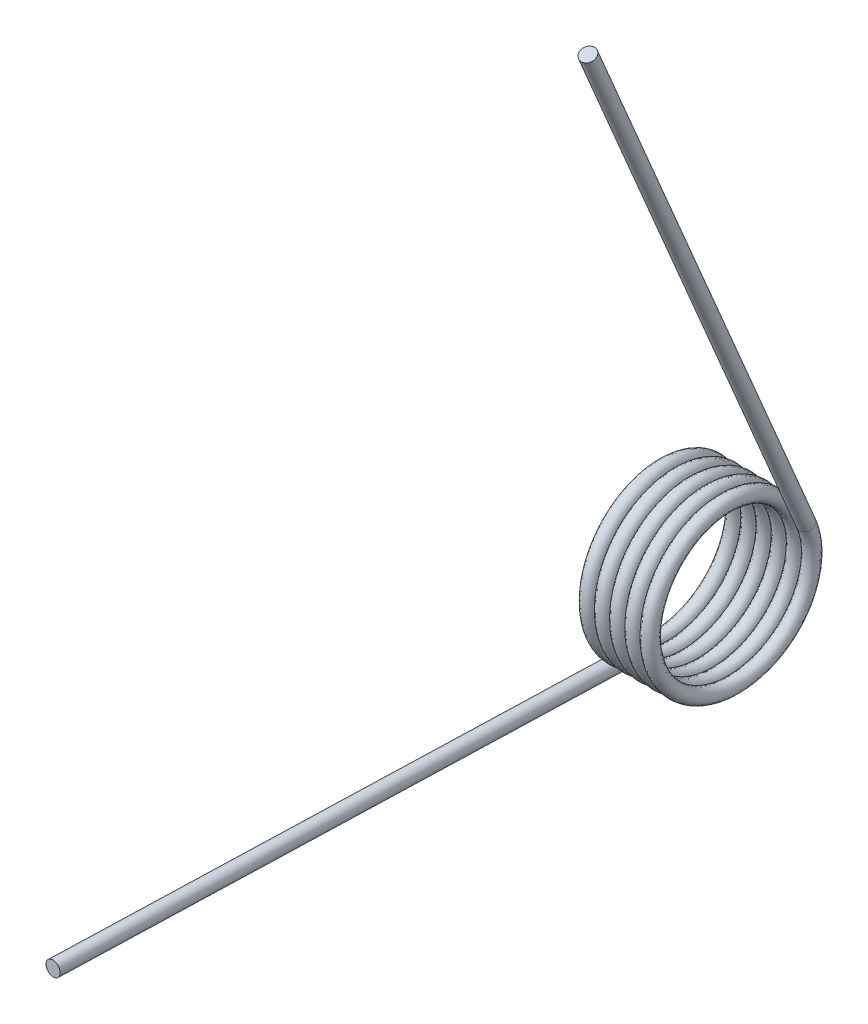
ISO-10303-21;
HEADER;
FILE_DESCRIPTION(('STEP AP214'),'2;1');
FILE_NAME('part.step','',(''),(''),'','','');
FILE_SCHEMA(('AUTOMOTIVE_DESIGN { 1 0 10303 214 1 1 1 1 }'));
ENDSEC;
DATA;
#1=APPLICATION_CONTEXT('core data for automotive mechanical design processes');
#2=APPLICATION_PROTOCOL_DEFINITION('international standard','automotive_design',2000,#1);
#3=PRODUCT_CONTEXT('',#1,'mechanical');
#4=PRODUCT('Part','Part','',(#3));
#5=PRODUCT_RELATED_PRODUCT_CATEGORY('part','',(#4));
#6=PRODUCT_DEFINITION_FORMATION('','',#4);
#7=PRODUCT_DEFINITION_CONTEXT('part definition',#1,'design');
#8=PRODUCT_DEFINITION('design','',#6,#7);
#9=PRODUCT_DEFINITION_SHAPE('','',#8);
#10=(LENGTH_UNIT() NAMED_UNIT(*) SI_UNIT(.MILLI.,.METRE.));
#11=(NAMED_UNIT(*) PLANE_ANGLE_UNIT() SI_UNIT($,.RADIAN.));
#12=(NAMED_UNIT(*) SI_UNIT($,.STERADIAN.) SOLID_ANGLE_UNIT());
#13=UNCERTAINTY_MEASURE_WITH_UNIT(LENGTH_MEASURE(1.E-05),#10,'distance_accuracy_value','');
#14=(GEOMETRIC_REPRESENTATION_CONTEXT(3) GLOBAL_UNCERTAINTY_ASSIGNED_CONTEXT((#13)) GLOBAL_UNIT_ASSIGNED_CONTEXT((#10,
#11,#12)) REPRESENTATION_CONTEXT('',''));
#15=CARTESIAN_POINT('',(0.,0.,0.));
#16=DIRECTION('',(0.,0.,1.));
#17=DIRECTION('',(1.,0.,0.));
#18=AXIS2_PLACEMENT_3D('',#15,#16,#17);
#19=CARTESIAN_POINT('',(-0.317343299420731,-3.34416700800665,-0.00997398179089064));
#20=CARTESIAN_POINT('',(-0.262309966087398,-3.33840852693478,-1.94072970407859));
#21=CARTESIAN_POINT('',(-0.207276632754065,-1.66344578239553,-2.901120574327));
#22=CARTESIAN_POINT('',(-0.152243299420732,0.011516962143726,-3.86151144457541));
#23=CARTESIAN_POINT('',(-0.0972099660873983,1.68072122561112,-2.89114659253611));
#24=CARTESIAN_POINT('',(-0.0421766327540651,3.34992548907851,-1.92078174049681));
#25=CARTESIAN_POINT('',(0.0128567005792681,3.34416700800665,0.00997398179089023));
#26=CARTESIAN_POINT('',(0.0678900339126013,3.33840852693478,1.94072970407859));
#27=CARTESIAN_POINT('',(0.122923367245935,1.66344578239553,2.901120574327));
#28=CARTESIAN_POINT('',(0.177956700579268,-0.0115169621437256,3.86151144457541));
#29=CARTESIAN_POINT('',(0.232990033912601,-1.68072122561112,2.89114659253611));
#30=CARTESIAN_POINT('',(0.288023367245934,-3.34992548907851,1.92078174049681));
#31=CARTESIAN_POINT('',(0.343056700579267,-3.34416700800665,-0.00997398179089064));
#32=CARTESIAN_POINT('',(0.3980900339126,-3.33840852693478,-1.94072970407859));
#33=CARTESIAN_POINT('',(0.453123367245934,-1.66344578239553,-2.901120574327));
#34=CARTESIAN_POINT('',(0.508156700579267,0.011516962143726,-3.86151144457541));
#35=CARTESIAN_POINT('',(0.5631900339126,1.68072122561112,-2.89114659253611));
#36=CARTESIAN_POINT('',(0.618223367245933,3.34992548907851,-1.92078174049681));
#37=CARTESIAN_POINT('',(0.673256700579266,3.34416700800665,0.00997398179089023));
#38=CARTESIAN_POINT('',(0.7282900339126,3.33840852693478,1.94072970407859));
#39=CARTESIAN_POINT('',(0.783323367245933,1.66344578239553,2.901120574327));
#40=CARTESIAN_POINT('',(0.838356700579266,-0.0115169621437256,3.86151144457541));
#41=CARTESIAN_POINT('',(0.893390033912599,-1.68072122561112,2.89114659253611));
#42=CARTESIAN_POINT('',(0.948423367245932,-3.34992548907851,1.92078174049681));
#43=CARTESIAN_POINT('',(1.00345670057927,-3.34416700800665,-0.00997398179089064));
#44=CARTESIAN_POINT('',(1.0584900339126,-3.33840852693478,-1.94072970407859));
#45=CARTESIAN_POINT('',(1.11352336724593,-1.66344578239553,-2.901120574327));
#46=CARTESIAN_POINT('',(1.16855670057927,0.011516962143726,-3.86151144457541));
#47=CARTESIAN_POINT('',(1.2235900339126,1.68072122561112,-2.89114659253611));
#48=CARTESIAN_POINT('',(1.27862336724593,3.34992548907851,-1.92078174049681));
#49=CARTESIAN_POINT('',(1.33365670057926,3.34416700800665,0.00997398179089023));
#50=CARTESIAN_POINT('',(1.3886900339126,3.33840852693478,1.94072970407859));
#51=CARTESIAN_POINT('',(1.44372336724593,1.66344578239553,2.901120574327));
#52=CARTESIAN_POINT('',(1.49875670057926,-0.0115169621437256,3.86151144457541));
#53=CARTESIAN_POINT('',(1.5537900339126,-1.68072122561112,2.89114659253611));
#54=CARTESIAN_POINT('',(1.60882336724593,-3.34992548907851,1.92078174049681));
#55=CARTESIAN_POINT('',(1.66385670057926,-3.34416700800665,-0.00997398179089064));
#56=CARTESIAN_POINT('',(1.7188900339126,-3.33840852693478,-1.94072970407859));
#57=CARTESIAN_POINT('',(1.77392336724593,-1.66344578239553,-2.901120574327));
#58=CARTESIAN_POINT('',(1.82895670057926,0.011516962143726,-3.86151144457541));
#59=CARTESIAN_POINT('',(1.8839900339126,1.68072122561112,-2.89114659253611));
#60=CARTESIAN_POINT('',(1.93902336724593,3.34992548907851,-1.92078174049681));
#61=CARTESIAN_POINT('',(1.99405670057926,3.34416700800665,0.00997398179089023));
#62=CARTESIAN_POINT('',(2.0490900339126,3.33840852693478,1.94072970407859));
#63=CARTESIAN_POINT('',(2.10412336724593,1.66344578239553,2.901120574327));
#64=CARTESIAN_POINT('',(2.15915670057926,-0.0115169621437256,3.86151144457541));
#65=CARTESIAN_POINT('',(2.2141900339126,-1.68072122561112,2.89114659253611));
#66=CARTESIAN_POINT('',(2.26922336724593,-3.34992548907851,1.92078174049681));
#67=CARTESIAN_POINT('',(2.32425670057926,-3.34416700800665,-0.00997398179089064));
#68=CARTESIAN_POINT('',(2.3792900339126,-3.33840852693478,-1.94072970407859));
#69=CARTESIAN_POINT('',(2.43432336724593,-1.66344578239553,-2.901120574327));
#70=CARTESIAN_POINT('',(2.48935670057926,0.011516962143726,-3.86151144457541));
#71=CARTESIAN_POINT('',(2.54439003391259,1.68072122561112,-2.89114659253611));
#72=CARTESIAN_POINT('',(2.59942336724593,3.34992548907851,-1.92078174049681));
#73=CARTESIAN_POINT('',(2.65445670057926,3.34416700800665,0.00997398179089023));
#74=CARTESIAN_POINT('',(2.70949003391259,3.33840852693478,1.94072970407859));
#75=CARTESIAN_POINT('',(2.76452336724593,1.66344578239553,2.901120574327));
#76=CARTESIAN_POINT('',(2.81955670057926,-0.0115169621437256,3.86151144457541));
#77=CARTESIAN_POINT('',(2.87459003391259,-1.68072122561112,2.89114659253611));
#78=CARTESIAN_POINT('',(2.92962336724593,-3.34992548907851,1.92078174049681));
#79=CARTESIAN_POINT('',(2.98465670057926,-3.34416700800665,-0.00997398179089064));
#80=CARTESIAN_POINT('',(3.03969003391259,-3.33840852693478,-1.94072970407859));
#81=CARTESIAN_POINT('',(3.09472336724593,-1.66344578239553,-2.901120574327));
#82=CARTESIAN_POINT('',(3.14975670057926,0.011516962143726,-3.86151144457541));
#83=CARTESIAN_POINT('',(3.20479003391259,1.68072122561112,-2.89114659253611));
#84=CARTESIAN_POINT('',(3.25982336724593,3.34992548907851,-1.92078174049681));
#85=CARTESIAN_POINT('',(3.31485670057926,3.34416700800665,0.00997398179089023));
#86=CARTESIAN_POINT('',(3.36989003391259,3.33840852693478,1.94072970407859));
#87=CARTESIAN_POINT('',(3.42492336724593,1.66344578239553,2.901120574327));
#88=CARTESIAN_POINT('',(3.47995670057926,-0.0115169621437256,3.86151144457541));
#89=CARTESIAN_POINT('',(3.53499003391259,-1.68072122561112,2.89114659253611));
#90=CARTESIAN_POINT('',(3.59002336724593,-3.34992548907851,1.92078174049681));
#91=CARTESIAN_POINT('',(3.64505670057926,-3.34416700800665,-0.00997398179089064));
#92=CARTESIAN_POINT('',(-0.317343299420731,-2.70916700800665,-0.00997398179088432));
#93=CARTESIAN_POINT('',(-0.262309966087398,-2.70340852693479,-1.57411228314317));
#94=CARTESIAN_POINT('',(-0.207276632754065,-1.34594578239553,-2.35119444292388));
#95=CARTESIAN_POINT('',(-0.152243299420732,0.0115169621437188,-3.12827660270458));
#96=CARTESIAN_POINT('',(-0.0972099660873985,1.36322122561111,-2.34122046113299));
#97=CARTESIAN_POINT('',(-0.0421766327540653,2.71492548907851,-1.55416431956141));
#98=CARTESIAN_POINT('',(0.0128567005792679,2.70916700800665,0.00997398179088399));
#99=CARTESIAN_POINT('',(0.0678900339126011,2.70340852693479,1.57411228314317));
#100=CARTESIAN_POINT('',(0.122923367245934,1.34594578239554,2.35119444292388));
#101=CARTESIAN_POINT('',(0.177956700579267,-0.0115169621437184,3.12827660270458));
#102=CARTESIAN_POINT('',(0.232990033912601,-1.36322122561111,2.34122046113299));
#103=CARTESIAN_POINT('',(0.288023367245934,-2.71492548907851,1.55416431956141));
#104=CARTESIAN_POINT('',(0.343056700579267,-2.70916700800665,-0.00997398179088432));
#105=CARTESIAN_POINT('',(0.3980900339126,-2.70340852693479,-1.57411228314317));
#106=CARTESIAN_POINT('',(0.453123367245934,-1.34594578239553,-2.35119444292388));
#107=CARTESIAN_POINT('',(0.508156700579267,0.0115169621437188,-3.12827660270458));
#108=CARTESIAN_POINT('',(0.5631900339126,1.36322122561111,-2.34122046113299));
#109=CARTESIAN_POINT('',(0.618223367245933,2.71492548907851,-1.55416431956141));
#110=CARTESIAN_POINT('',(0.673256700579266,2.70916700800665,0.00997398179088399));
#111=CARTESIAN_POINT('',(0.728290033912599,2.70340852693479,1.57411228314317));
#112=CARTESIAN_POINT('',(0.783323367245933,1.34594578239554,2.35119444292388));
#113=CARTESIAN_POINT('',(0.838356700579266,-0.0115169621437184,3.12827660270458));
#114=CARTESIAN_POINT('',(0.893390033912599,-1.36322122561111,2.34122046113299));
#115=CARTESIAN_POINT('',(0.948423367245932,-2.71492548907851,1.55416431956141));
#116=CARTESIAN_POINT('',(1.00345670057927,-2.70916700800665,-0.00997398179088432));
#117=CARTESIAN_POINT('',(1.0584900339126,-2.70340852693479,-1.57411228314317));
#118=CARTESIAN_POINT('',(1.11352336724593,-1.34594578239553,-2.35119444292388));
#119=CARTESIAN_POINT('',(1.16855670057926,0.0115169621437188,-3.12827660270458));
#120=CARTESIAN_POINT('',(1.2235900339126,1.36322122561111,-2.34122046113299));
#121=CARTESIAN_POINT('',(1.27862336724593,2.71492548907851,-1.55416431956141));
#122=CARTESIAN_POINT('',(1.33365670057926,2.70916700800665,0.00997398179088399));
#123=CARTESIAN_POINT('',(1.3886900339126,2.70340852693479,1.57411228314317));
#124=CARTESIAN_POINT('',(1.44372336724593,1.34594578239554,2.35119444292388));
#125=CARTESIAN_POINT('',(1.49875670057926,-0.0115169621437184,3.12827660270458));
#126=CARTESIAN_POINT('',(1.5537900339126,-1.36322122561111,2.34122046113299));
#127=CARTESIAN_POINT('',(1.60882336724593,-2.71492548907851,1.55416431956141));
#128=CARTESIAN_POINT('',(1.66385670057926,-2.70916700800665,-0.00997398179088432));
#129=CARTESIAN_POINT('',(1.7188900339126,-2.70340852693479,-1.57411228314317));
#130=CARTESIAN_POINT('',(1.77392336724593,-1.34594578239553,-2.35119444292388));
#131=CARTESIAN_POINT('',(1.82895670057926,0.0115169621437188,-3.12827660270458));
#132=CARTESIAN_POINT('',(1.8839900339126,1.36322122561111,-2.34122046113299));
#133=CARTESIAN_POINT('',(1.93902336724593,2.71492548907851,-1.55416431956141));
#134=CARTESIAN_POINT('',(1.99405670057926,2.70916700800665,0.00997398179088399));
#135=CARTESIAN_POINT('',(2.0490900339126,2.70340852693479,1.57411228314317));
#136=CARTESIAN_POINT('',(2.10412336724593,1.34594578239554,2.35119444292388));
#137=CARTESIAN_POINT('',(2.15915670057926,-0.0115169621437184,3.12827660270458));
#138=CARTESIAN_POINT('',(2.2141900339126,-1.36322122561111,2.34122046113299));
#139=CARTESIAN_POINT('',(2.26922336724593,-2.71492548907851,1.55416431956141));
#140=CARTESIAN_POINT('',(2.32425670057926,-2.70916700800665,-0.00997398179088432));
#141=CARTESIAN_POINT('',(2.3792900339126,-2.70340852693479,-1.57411228314317));
#142=CARTESIAN_POINT('',(2.43432336724593,-1.34594578239553,-2.35119444292388));
#143=CARTESIAN_POINT('',(2.48935670057926,0.0115169621437188,-3.12827660270458));
#144=CARTESIAN_POINT('',(2.54439003391259,1.36322122561111,-2.34122046113299));
#145=CARTESIAN_POINT('',(2.59942336724593,2.71492548907851,-1.55416431956141));
#146=CARTESIAN_POINT('',(2.65445670057926,2.70916700800665,0.00997398179088399));
#147=CARTESIAN_POINT('',(2.70949003391259,2.70340852693479,1.57411228314317));
#148=CARTESIAN_POINT('',(2.76452336724593,1.34594578239554,2.35119444292388));
#149=CARTESIAN_POINT('',(2.81955670057926,-0.0115169621437184,3.12827660270458));
#150=CARTESIAN_POINT('',(2.87459003391259,-1.36322122561111,2.34122046113299));
#151=CARTESIAN_POINT('',(2.92962336724593,-2.71492548907851,1.55416431956141));
#152=CARTESIAN_POINT('',(2.98465670057926,-2.70916700800665,-0.00997398179088432));
#153=CARTESIAN_POINT('',(3.03969003391259,-2.70340852693479,-1.57411228314317));
#154=CARTESIAN_POINT('',(3.09472336724593,-1.34594578239553,-2.35119444292388));
#155=CARTESIAN_POINT('',(3.14975670057926,0.0115169621437188,-3.12827660270458));
#156=CARTESIAN_POINT('',(3.20479003391259,1.36322122561111,-2.34122046113299));
#157=CARTESIAN_POINT('',(3.25982336724593,2.71492548907851,-1.55416431956141));
#158=CARTESIAN_POINT('',(3.31485670057926,2.70916700800665,0.00997398179088399));
#159=CARTESIAN_POINT('',(3.36989003391259,2.70340852693479,1.57411228314317));
#160=CARTESIAN_POINT('',(3.42492336724593,1.34594578239554,2.35119444292388));
#161=CARTESIAN_POINT('',(3.47995670057926,-0.0115169621437184,3.12827660270458));
#162=CARTESIAN_POINT('',(3.53499003391259,-1.36322122561111,2.34122046113299));
#163=CARTESIAN_POINT('',(3.59002336724593,-2.71492548907851,1.55416431956141));
#164=CARTESIAN_POINT('',(3.64505670057926,-2.70916700800665,-0.00997398179088432));
#165=CARTESIAN_POINT('',(0.317343299420731,-2.70916700800665,0.00997398179082691));
#166=CARTESIAN_POINT('',(0.372376632754064,-2.71492548907847,-1.55416431956146));
#167=CARTESIAN_POINT('',(0.427409966087397,-1.36322122561106,-2.34122046113302));
#168=CARTESIAN_POINT('',(0.48244329942073,-0.0115169621436529,-3.12827660270458));
#169=CARTESIAN_POINT('',(0.537476632754064,1.34594578239558,-2.35119444292385));
#170=CARTESIAN_POINT('',(0.592509966087397,2.70340852693482,-1.57411228314312));
#171=CARTESIAN_POINT('',(0.64754329942073,2.70916700800665,-0.00997398179082724));
#172=CARTESIAN_POINT('',(0.702576632754063,2.71492548907847,1.55416431956146));
#173=CARTESIAN_POINT('',(0.757609966087396,1.36322122561106,2.34122046113302));
#174=CARTESIAN_POINT('',(0.81264329942073,0.0115169621436533,3.12827660270458));
#175=CARTESIAN_POINT('',(0.867676632754063,-1.34594578239558,2.35119444292385));
#176=CARTESIAN_POINT('',(0.922709966087396,-2.70340852693482,1.57411228314312));
#177=CARTESIAN_POINT('',(0.977743299420729,-2.70916700800665,0.00997398179082691));
#178=CARTESIAN_POINT('',(1.03277663275406,-2.71492548907847,-1.55416431956146));
#179=CARTESIAN_POINT('',(1.0878099660874,-1.36322122561106,-2.34122046113302));
#180=CARTESIAN_POINT('',(1.14284329942073,-0.0115169621436529,-3.12827660270458));
#181=CARTESIAN_POINT('',(1.19787663275406,1.34594578239558,-2.35119444292385));
#182=CARTESIAN_POINT('',(1.2529099660874,2.70340852693482,-1.57411228314312));
#183=CARTESIAN_POINT('',(1.30794329942073,2.70916700800665,-0.00997398179082724));
#184=CARTESIAN_POINT('',(1.36297663275406,2.71492548907847,1.55416431956146));
#185=CARTESIAN_POINT('',(1.41800996608739,1.36322122561106,2.34122046113302));
#186=CARTESIAN_POINT('',(1.47304329942073,0.0115169621436533,3.12827660270458));
#187=CARTESIAN_POINT('',(1.52807663275406,-1.34594578239558,2.35119444292385));
#188=CARTESIAN_POINT('',(1.58310996608739,-2.70340852693482,1.57411228314312));
#189=CARTESIAN_POINT('',(1.63814329942073,-2.70916700800665,0.00997398179082691));
#190=CARTESIAN_POINT('',(1.69317663275406,-2.71492548907847,-1.55416431956146));
#191=CARTESIAN_POINT('',(1.74820996608739,-1.36322122561106,-2.34122046113302));
#192=CARTESIAN_POINT('',(1.80324329942073,-0.0115169621436529,-3.12827660270458));
#193=CARTESIAN_POINT('',(1.85827663275406,1.34594578239558,-2.35119444292385));
#194=CARTESIAN_POINT('',(1.91330996608739,2.70340852693482,-1.57411228314312));
#195=CARTESIAN_POINT('',(1.96834329942073,2.70916700800665,-0.00997398179082724));
#196=CARTESIAN_POINT('',(2.02337663275406,2.71492548907847,1.55416431956146));
#197=CARTESIAN_POINT('',(2.07840996608739,1.36322122561106,2.34122046113302));
#198=CARTESIAN_POINT('',(2.13344329942073,0.0115169621436533,3.12827660270458));
#199=CARTESIAN_POINT('',(2.18847663275406,-1.34594578239558,2.35119444292385));
#200=CARTESIAN_POINT('',(2.24350996608739,-2.70340852693482,1.57411228314312));
#201=CARTESIAN_POINT('',(2.29854329942073,-2.70916700800665,0.00997398179082691));
#202=CARTESIAN_POINT('',(2.35357663275406,-2.71492548907847,-1.55416431956146));
#203=CARTESIAN_POINT('',(2.40860996608739,-1.36322122561106,-2.34122046113302));
#204=CARTESIAN_POINT('',(2.46364329942073,-0.0115169621436529,-3.12827660270458));
#205=CARTESIAN_POINT('',(2.51867663275406,1.34594578239558,-2.35119444292385));
#206=CARTESIAN_POINT('',(2.57370996608739,2.70340852693482,-1.57411228314312));
#207=CARTESIAN_POINT('',(2.62874329942073,2.70916700800665,-0.00997398179082724));
#208=CARTESIAN_POINT('',(2.68377663275406,2.71492548907847,1.55416431956146));
#209=CARTESIAN_POINT('',(2.73880996608739,1.36322122561106,2.34122046113302));
#210=CARTESIAN_POINT('',(2.79384329942072,0.0115169621436533,3.12827660270458));
#211=CARTESIAN_POINT('',(2.84887663275406,-1.34594578239558,2.35119444292385));
#212=CARTESIAN_POINT('',(2.90390996608739,-2.70340852693482,1.57411228314312));
#213=CARTESIAN_POINT('',(2.95894329942072,-2.70916700800665,0.00997398179082691));
#214=CARTESIAN_POINT('',(3.01397663275406,-2.71492548907847,-1.55416431956146));
#215=CARTESIAN_POINT('',(3.06900996608739,-1.36322122561106,-2.34122046113302));
#216=CARTESIAN_POINT('',(3.12404329942072,-0.0115169621436529,-3.12827660270458));
#217=CARTESIAN_POINT('',(3.17907663275406,1.34594578239558,-2.35119444292385));
#218=CARTESIAN_POINT('',(3.23410996608739,2.70340852693482,-1.57411228314312));
#219=CARTESIAN_POINT('',(3.28914329942072,2.70916700800665,-0.00997398179082724));
#220=CARTESIAN_POINT('',(3.34417663275406,2.71492548907847,1.55416431956146));
#221=CARTESIAN_POINT('',(3.39920996608739,1.36322122561106,2.34122046113302));
#222=CARTESIAN_POINT('',(3.45424329942072,0.0115169621436533,3.12827660270458));
#223=CARTESIAN_POINT('',(3.50927663275406,-1.34594578239558,2.35119444292385));
#224=CARTESIAN_POINT('',(3.56430996608739,-2.70340852693482,1.57411228314312));
#225=CARTESIAN_POINT('',(3.61934329942072,-2.70916700800665,0.00997398179082691));
#226=CARTESIAN_POINT('',(3.67437663275406,-2.71492548907847,-1.55416431956146));
#227=CARTESIAN_POINT('',(3.72940996608739,-1.36322122561106,-2.34122046113302));
#228=CARTESIAN_POINT('',(3.78444329942072,-0.0115169621436529,-3.12827660270458));
#229=CARTESIAN_POINT('',(3.83947663275406,1.34594578239558,-2.35119444292385));
#230=CARTESIAN_POINT('',(3.89450996608739,2.70340852693482,-1.57411228314312));
#231=CARTESIAN_POINT('',(3.94954329942072,2.70916700800665,-0.00997398179082724));
#232=CARTESIAN_POINT('',(4.00457663275406,2.71492548907847,1.55416431956146));
#233=CARTESIAN_POINT('',(4.05960996608739,1.36322122561106,2.34122046113302));
#234=CARTESIAN_POINT('',(4.11464329942072,0.0115169621436533,3.12827660270458));
#235=CARTESIAN_POINT('',(4.16967663275405,-1.34594578239558,2.35119444292385));
#236=CARTESIAN_POINT('',(4.22470996608739,-2.70340852693482,1.57411228314312));
#237=CARTESIAN_POINT('',(4.27974329942072,-2.70916700800665,0.00997398179082691));
#238=CARTESIAN_POINT('',(0.317343299420731,-3.34416700800665,0.00997398179082059));
#239=CARTESIAN_POINT('',(0.372376632754064,-3.34992548907847,-1.92078174049688));
#240=CARTESIAN_POINT('',(0.427409966087398,-1.68072122561106,-2.89114659253614));
#241=CARTESIAN_POINT('',(0.482443299420731,-0.0115169621436456,-3.86151144457541));
#242=CARTESIAN_POINT('',(0.537476632754064,1.66344578239559,-2.90112057432696));
#243=CARTESIAN_POINT('',(0.592509966087397,3.33840852693482,-1.94072970407852));
#244=CARTESIAN_POINT('',(0.64754329942073,3.34416700800665,-0.009973981790821));
#245=CARTESIAN_POINT('',(0.702576632754063,3.34992548907847,1.92078174049688));
#246=CARTESIAN_POINT('',(0.757609966087397,1.68072122561106,2.89114659253614));
#247=CARTESIAN_POINT('',(0.81264329942073,0.0115169621436461,3.86151144457541));
#248=CARTESIAN_POINT('',(0.867676632754063,-1.66344578239559,2.90112057432697));
#249=CARTESIAN_POINT('',(0.922709966087396,-3.33840852693482,1.94072970407852));
#250=CARTESIAN_POINT('',(0.977743299420729,-3.34416700800665,0.00997398179082059));
#251=CARTESIAN_POINT('',(1.03277663275406,-3.34992548907847,-1.92078174049688));
#252=CARTESIAN_POINT('',(1.0878099660874,-1.68072122561106,-2.89114659253614));
#253=CARTESIAN_POINT('',(1.14284329942073,-0.0115169621436456,-3.86151144457541));
#254=CARTESIAN_POINT('',(1.19787663275406,1.66344578239559,-2.90112057432696));
#255=CARTESIAN_POINT('',(1.2529099660874,3.33840852693482,-1.94072970407852));
#256=CARTESIAN_POINT('',(1.30794329942073,3.34416700800665,-0.009973981790821));
#257=CARTESIAN_POINT('',(1.36297663275406,3.34992548907847,1.92078174049688));
#258=CARTESIAN_POINT('',(1.4180099660874,1.68072122561106,2.89114659253614));
#259=CARTESIAN_POINT('',(1.47304329942073,0.0115169621436461,3.86151144457541));
#260=CARTESIAN_POINT('',(1.52807663275406,-1.66344578239559,2.90112057432697));
#261=CARTESIAN_POINT('',(1.58310996608739,-3.33840852693482,1.94072970407852));
#262=CARTESIAN_POINT('',(1.63814329942073,-3.34416700800665,0.00997398179082059));
#263=CARTESIAN_POINT('',(1.69317663275406,-3.34992548907847,-1.92078174049688));
#264=CARTESIAN_POINT('',(1.74820996608739,-1.68072122561106,-2.89114659253614));
#265=CARTESIAN_POINT('',(1.80324329942073,-0.0115169621436456,-3.86151144457541));
#266=CARTESIAN_POINT('',(1.85827663275406,1.66344578239559,-2.90112057432696));
#267=CARTESIAN_POINT('',(1.91330996608739,3.33840852693482,-1.94072970407852));
#268=CARTESIAN_POINT('',(1.96834329942073,3.34416700800665,-0.009973981790821));
#269=CARTESIAN_POINT('',(2.02337663275406,3.34992548907847,1.92078174049688));
#270=CARTESIAN_POINT('',(2.07840996608739,1.68072122561106,2.89114659253614));
#271=CARTESIAN_POINT('',(2.13344329942073,0.0115169621436461,3.86151144457541));
#272=CARTESIAN_POINT('',(2.18847663275406,-1.66344578239559,2.90112057432697));
#273=CARTESIAN_POINT('',(2.24350996608739,-3.33840852693482,1.94072970407852));
#274=CARTESIAN_POINT('',(2.29854329942073,-3.34416700800665,0.00997398179082059));
#275=CARTESIAN_POINT('',(2.35357663275406,-3.34992548907847,-1.92078174049688));
#276=CARTESIAN_POINT('',(2.40860996608739,-1.68072122561106,-2.89114659253614));
#277=CARTESIAN_POINT('',(2.46364329942073,-0.0115169621436456,-3.86151144457541));
#278=CARTESIAN_POINT('',(2.51867663275406,1.66344578239559,-2.90112057432696));
#279=CARTESIAN_POINT('',(2.57370996608739,3.33840852693482,-1.94072970407852));
#280=CARTESIAN_POINT('',(2.62874329942073,3.34416700800665,-0.009973981790821));
#281=CARTESIAN_POINT('',(2.68377663275406,3.34992548907847,1.92078174049688));
#282=CARTESIAN_POINT('',(2.73880996608739,1.68072122561106,2.89114659253614));
#283=CARTESIAN_POINT('',(2.79384329942072,0.0115169621436461,3.86151144457541));
#284=CARTESIAN_POINT('',(2.84887663275406,-1.66344578239559,2.90112057432697));
#285=CARTESIAN_POINT('',(2.90390996608739,-3.33840852693482,1.94072970407852));
#286=CARTESIAN_POINT('',(2.95894329942072,-3.34416700800665,0.00997398179082059));
#287=CARTESIAN_POINT('',(3.01397663275406,-3.34992548907847,-1.92078174049688));
#288=CARTESIAN_POINT('',(3.06900996608739,-1.68072122561106,-2.89114659253614));
#289=CARTESIAN_POINT('',(3.12404329942072,-0.0115169621436456,-3.86151144457541));
#290=CARTESIAN_POINT('',(3.17907663275406,1.66344578239559,-2.90112057432696));
#291=CARTESIAN_POINT('',(3.23410996608739,3.33840852693482,-1.94072970407852));
#292=CARTESIAN_POINT('',(3.28914329942072,3.34416700800665,-0.009973981790821));
#293=CARTESIAN_POINT('',(3.34417663275406,3.34992548907847,1.92078174049688));
#294=CARTESIAN_POINT('',(3.39920996608739,1.68072122561106,2.89114659253614));
#295=CARTESIAN_POINT('',(3.45424329942072,0.0115169621436461,3.86151144457541));
#296=CARTESIAN_POINT('',(3.50927663275406,-1.66344578239559,2.90112057432697));
#297=CARTESIAN_POINT('',(3.56430996608739,-3.33840852693482,1.94072970407852));
#298=CARTESIAN_POINT('',(3.61934329942072,-3.34416700800665,0.00997398179082059));
#299=CARTESIAN_POINT('',(3.67437663275406,-3.34992548907847,-1.92078174049688));
#300=CARTESIAN_POINT('',(3.72940996608739,-1.68072122561106,-2.89114659253614));
#301=CARTESIAN_POINT('',(3.78444329942072,-0.0115169621436456,-3.86151144457541));
#302=CARTESIAN_POINT('',(3.83947663275406,1.66344578239559,-2.90112057432696));
#303=CARTESIAN_POINT('',(3.89450996608739,3.33840852693482,-1.94072970407852));
#304=CARTESIAN_POINT('',(3.94954329942072,3.34416700800665,-0.009973981790821));
#305=CARTESIAN_POINT('',(4.00457663275405,3.34992548907847,1.92078174049688));
#306=CARTESIAN_POINT('',(4.05960996608739,1.68072122561106,2.89114659253614));
#307=CARTESIAN_POINT('',(4.11464329942072,0.0115169621436461,3.86151144457541));
#308=CARTESIAN_POINT('',(4.16967663275405,-1.66344578239559,2.90112057432697));
#309=CARTESIAN_POINT('',(4.22470996608739,-3.33840852693482,1.94072970407852));
#310=CARTESIAN_POINT('',(4.27974329942072,-3.34416700800665,0.00997398179082059));
#311=CARTESIAN_POINT('',(0.317343299420731,-3.97916700800665,0.00997398179081427));
#312=CARTESIAN_POINT('',(0.372376632754065,-3.98492548907847,-2.2873991614323));
#313=CARTESIAN_POINT('',(0.427409966087398,-1.99822122561105,-3.44107272393926));
#314=CARTESIAN_POINT('',(0.482443299420731,-0.0115169621436384,-4.59474628644623));
#315=CARTESIAN_POINT('',(0.537476632754064,1.98094578239559,-3.45104670573008));
#316=CARTESIAN_POINT('',(0.592509966087397,3.97340852693483,-2.30734712501393));
#317=CARTESIAN_POINT('',(0.647543299420731,3.97916700800665,-0.00997398179081476));
#318=CARTESIAN_POINT('',(0.702576632754064,3.98492548907847,2.2873991614323));
#319=CARTESIAN_POINT('',(0.757609966087397,1.99822122561105,3.44107272393926));
#320=CARTESIAN_POINT('',(0.81264329942073,0.0115169621436389,4.59474628644623));
#321=CARTESIAN_POINT('',(0.867676632754063,-1.98094578239559,3.45104670573008));
#322=CARTESIAN_POINT('',(0.922709966087397,-3.97340852693483,2.30734712501393));
#323=CARTESIAN_POINT('',(0.97774329942073,-3.97916700800665,0.00997398179081427));
#324=CARTESIAN_POINT('',(1.03277663275406,-3.98492548907847,-2.2873991614323));
#325=CARTESIAN_POINT('',(1.0878099660874,-1.99822122561105,-3.44107272393926));
#326=CARTESIAN_POINT('',(1.14284329942073,-0.0115169621436384,-4.59474628644623));
#327=CARTESIAN_POINT('',(1.19787663275406,1.98094578239559,-3.45104670573008));
#328=CARTESIAN_POINT('',(1.2529099660874,3.97340852693483,-2.30734712501393));
#329=CARTESIAN_POINT('',(1.30794329942073,3.97916700800665,-0.00997398179081476));
#330=CARTESIAN_POINT('',(1.36297663275406,3.98492548907847,2.2873991614323));
#331=CARTESIAN_POINT('',(1.4180099660874,1.99822122561105,3.44107272393926));
#332=CARTESIAN_POINT('',(1.47304329942073,0.0115169621436389,4.59474628644623));
#333=CARTESIAN_POINT('',(1.52807663275406,-1.98094578239559,3.45104670573008));
#334=CARTESIAN_POINT('',(1.5831099660874,-3.97340852693483,2.30734712501393));
#335=CARTESIAN_POINT('',(1.63814329942073,-3.97916700800665,0.00997398179081427));
#336=CARTESIAN_POINT('',(1.69317663275406,-3.98492548907847,-2.2873991614323));
#337=CARTESIAN_POINT('',(1.74820996608739,-1.99822122561105,-3.44107272393926));
#338=CARTESIAN_POINT('',(1.80324329942073,-0.0115169621436384,-4.59474628644623));
#339=CARTESIAN_POINT('',(1.85827663275406,1.98094578239559,-3.45104670573008));
#340=CARTESIAN_POINT('',(1.91330996608739,3.97340852693483,-2.30734712501393));
#341=CARTESIAN_POINT('',(1.96834329942073,3.97916700800665,-0.00997398179081476));
#342=CARTESIAN_POINT('',(2.02337663275406,3.98492548907847,2.2873991614323));
#343=CARTESIAN_POINT('',(2.07840996608739,1.99822122561105,3.44107272393926));
#344=CARTESIAN_POINT('',(2.13344329942073,0.0115169621436389,4.59474628644623));
#345=CARTESIAN_POINT('',(2.18847663275406,-1.98094578239559,3.45104670573008));
#346=CARTESIAN_POINT('',(2.24350996608739,-3.97340852693483,2.30734712501393));
#347=CARTESIAN_POINT('',(2.29854329942073,-3.97916700800665,0.00997398179081427));
#348=CARTESIAN_POINT('',(2.35357663275406,-3.98492548907847,-2.2873991614323));
#349=CARTESIAN_POINT('',(2.40860996608739,-1.99822122561105,-3.44107272393926));
#350=CARTESIAN_POINT('',(2.46364329942073,-0.0115169621436384,-4.59474628644623));
#351=CARTESIAN_POINT('',(2.51867663275406,1.98094578239559,-3.45104670573008));
#352=CARTESIAN_POINT('',(2.57370996608739,3.97340852693483,-2.30734712501393));
#353=CARTESIAN_POINT('',(2.62874329942073,3.97916700800665,-0.00997398179081476));
#354=CARTESIAN_POINT('',(2.68377663275406,3.98492548907847,2.2873991614323));
#355=CARTESIAN_POINT('',(2.73880996608739,1.99822122561105,3.44107272393926));
#356=CARTESIAN_POINT('',(2.79384329942073,0.0115169621436389,4.59474628644623));
#357=CARTESIAN_POINT('',(2.84887663275406,-1.98094578239559,3.45104670573008));
#358=CARTESIAN_POINT('',(2.90390996608739,-3.97340852693483,2.30734712501393));
#359=CARTESIAN_POINT('',(2.95894329942072,-3.97916700800665,0.00997398179081427));
#360=CARTESIAN_POINT('',(3.01397663275406,-3.98492548907847,-2.2873991614323));
#361=CARTESIAN_POINT('',(3.06900996608739,-1.99822122561105,-3.44107272393926));
#362=CARTESIAN_POINT('',(3.12404329942072,-0.0115169621436384,-4.59474628644623));
#363=CARTESIAN_POINT('',(3.17907663275406,1.98094578239559,-3.45104670573008));
#364=CARTESIAN_POINT('',(3.23410996608739,3.97340852693483,-2.30734712501393));
#365=CARTESIAN_POINT('',(3.28914329942072,3.97916700800665,-0.00997398179081476));
#366=CARTESIAN_POINT('',(3.34417663275406,3.98492548907847,2.2873991614323));
#367=CARTESIAN_POINT('',(3.39920996608739,1.99822122561105,3.44107272393926));
#368=CARTESIAN_POINT('',(3.45424329942072,0.0115169621436389,4.59474628644623));
#369=CARTESIAN_POINT('',(3.50927663275406,-1.98094578239559,3.45104670573008));
#370=CARTESIAN_POINT('',(3.56430996608739,-3.97340852693483,2.30734712501393));
#371=CARTESIAN_POINT('',(3.61934329942072,-3.97916700800665,0.00997398179081427));
#372=CARTESIAN_POINT('',(3.67437663275406,-3.98492548907847,-2.2873991614323));
#373=CARTESIAN_POINT('',(3.72940996608739,-1.99822122561105,-3.44107272393926));
#374=CARTESIAN_POINT('',(3.78444329942072,-0.0115169621436384,-4.59474628644623));
#375=CARTESIAN_POINT('',(3.83947663275406,1.98094578239559,-3.45104670573008));
#376=CARTESIAN_POINT('',(3.89450996608739,3.97340852693483,-2.30734712501393));
#377=CARTESIAN_POINT('',(3.94954329942072,3.97916700800665,-0.00997398179081476));
#378=CARTESIAN_POINT('',(4.00457663275406,3.98492548907847,2.2873991614323));
#379=CARTESIAN_POINT('',(4.05960996608739,1.99822122561105,3.44107272393926));
#380=CARTESIAN_POINT('',(4.11464329942072,0.0115169621436389,4.59474628644623));
#381=CARTESIAN_POINT('',(4.16967663275406,-1.98094578239559,3.45104670573008));
#382=CARTESIAN_POINT('',(4.22470996608739,-3.97340852693483,2.30734712501393));
#383=CARTESIAN_POINT('',(4.27974329942072,-3.97916700800665,0.00997398179081427));
#384=CARTESIAN_POINT('',(-0.317343299420731,-3.97916700800665,-0.00997398179089696));
#385=CARTESIAN_POINT('',(-0.262309966087398,-3.97340852693478,-2.30734712501401));
#386=CARTESIAN_POINT('',(-0.207276632754064,-1.98094578239552,-3.45104670573012));
#387=CARTESIAN_POINT('',(-0.152243299420731,0.0115169621437333,-4.59474628644623));
#388=CARTESIAN_POINT('',(-0.0972099660873981,1.99822122561112,-3.44107272393922));
#389=CARTESIAN_POINT('',(-0.0421766327540649,3.98492548907851,-2.28739916143222));
#390=CARTESIAN_POINT('',(0.0128567005792683,3.97916700800665,0.00997398179089647));
#391=CARTESIAN_POINT('',(0.0678900339126016,3.97340852693478,2.30734712501401));
#392=CARTESIAN_POINT('',(0.122923367245935,1.98094578239552,3.45104670573012));
#393=CARTESIAN_POINT('',(0.177956700579268,-0.0115169621437327,4.59474628644623));
#394=CARTESIAN_POINT('',(0.232990033912601,-1.99822122561112,3.44107272393923));
#395=CARTESIAN_POINT('',(0.288023367245934,-3.98492548907851,2.28739916143222));
#396=CARTESIAN_POINT('',(0.343056700579268,-3.97916700800665,-0.00997398179089696));
#397=CARTESIAN_POINT('',(0.398090033912601,-3.97340852693478,-2.30734712501401));
#398=CARTESIAN_POINT('',(0.453123367245934,-1.98094578239552,-3.45104670573012));
#399=CARTESIAN_POINT('',(0.508156700579267,0.0115169621437333,-4.59474628644623));
#400=CARTESIAN_POINT('',(0.5631900339126,1.99822122561112,-3.44107272393922));
#401=CARTESIAN_POINT('',(0.618223367245934,3.98492548907851,-2.28739916143222));
#402=CARTESIAN_POINT('',(0.673256700579267,3.97916700800665,0.00997398179089647));
#403=CARTESIAN_POINT('',(0.7282900339126,3.97340852693478,2.30734712501401));
#404=CARTESIAN_POINT('',(0.783323367245933,1.98094578239552,3.45104670573012));
#405=CARTESIAN_POINT('',(0.838356700579266,-0.0115169621437327,4.59474628644623));
#406=CARTESIAN_POINT('',(0.8933900339126,-1.99822122561112,3.44107272393923));
#407=CARTESIAN_POINT('',(0.948423367245933,-3.98492548907851,2.28739916143222));
#408=CARTESIAN_POINT('',(1.00345670057927,-3.97916700800665,-0.00997398179089696));
#409=CARTESIAN_POINT('',(1.0584900339126,-3.97340852693478,-2.30734712501401));
#410=CARTESIAN_POINT('',(1.11352336724593,-1.98094578239552,-3.45104670573012));
#411=CARTESIAN_POINT('',(1.16855670057927,0.0115169621437333,-4.59474628644623));
#412=CARTESIAN_POINT('',(1.2235900339126,1.99822122561112,-3.44107272393922));
#413=CARTESIAN_POINT('',(1.27862336724593,3.98492548907851,-2.28739916143222));
#414=CARTESIAN_POINT('',(1.33365670057926,3.97916700800665,0.00997398179089647));
#415=CARTESIAN_POINT('',(1.3886900339126,3.97340852693478,2.30734712501401));
#416=CARTESIAN_POINT('',(1.44372336724593,1.98094578239552,3.45104670573012));
#417=CARTESIAN_POINT('',(1.49875670057926,-0.0115169621437327,4.59474628644623));
#418=CARTESIAN_POINT('',(1.5537900339126,-1.99822122561112,3.44107272393923));
#419=CARTESIAN_POINT('',(1.60882336724593,-3.98492548907851,2.28739916143222));
#420=CARTESIAN_POINT('',(1.66385670057926,-3.97916700800665,-0.00997398179089696));
#421=CARTESIAN_POINT('',(1.7188900339126,-3.97340852693478,-2.30734712501401));
#422=CARTESIAN_POINT('',(1.77392336724593,-1.98094578239552,-3.45104670573012));
#423=CARTESIAN_POINT('',(1.82895670057926,0.0115169621437333,-4.59474628644623));
#424=CARTESIAN_POINT('',(1.8839900339126,1.99822122561112,-3.44107272393922));
#425=CARTESIAN_POINT('',(1.93902336724593,3.98492548907851,-2.28739916143222));
#426=CARTESIAN_POINT('',(1.99405670057926,3.97916700800665,0.00997398179089647));
#427=CARTESIAN_POINT('',(2.0490900339126,3.97340852693478,2.30734712501401));
#428=CARTESIAN_POINT('',(2.10412336724593,1.98094578239552,3.45104670573012));
#429=CARTESIAN_POINT('',(2.15915670057926,-0.0115169621437327,4.59474628644623));
#430=CARTESIAN_POINT('',(2.2141900339126,-1.99822122561112,3.44107272393923));
#431=CARTESIAN_POINT('',(2.26922336724593,-3.98492548907851,2.28739916143222));
#432=CARTESIAN_POINT('',(2.32425670057926,-3.97916700800665,-0.00997398179089696));
#433=CARTESIAN_POINT('',(2.3792900339126,-3.97340852693478,-2.30734712501401));
#434=CARTESIAN_POINT('',(2.43432336724593,-1.98094578239552,-3.45104670573012));
#435=CARTESIAN_POINT('',(2.48935670057926,0.0115169621437333,-4.59474628644623));
#436=CARTESIAN_POINT('',(2.5443900339126,1.99822122561112,-3.44107272393922));
#437=CARTESIAN_POINT('',(2.59942336724593,3.98492548907851,-2.28739916143222));
#438=CARTESIAN_POINT('',(2.65445670057926,3.97916700800665,0.00997398179089647));
#439=CARTESIAN_POINT('',(2.7094900339126,3.97340852693478,2.30734712501401));
#440=CARTESIAN_POINT('',(2.76452336724593,1.98094578239552,3.45104670573012));
#441=CARTESIAN_POINT('',(2.81955670057926,-0.0115169621437327,4.59474628644623));
#442=CARTESIAN_POINT('',(2.87459003391259,-1.99822122561112,3.44107272393923));
#443=CARTESIAN_POINT('',(2.92962336724593,-3.98492548907851,2.28739916143222));
#444=CARTESIAN_POINT('',(2.98465670057926,-3.97916700800665,-0.00997398179089696));
#445=CARTESIAN_POINT('',(3.03969003391259,-3.97340852693478,-2.30734712501401));
#446=CARTESIAN_POINT('',(3.09472336724593,-1.98094578239552,-3.45104670573012));
#447=CARTESIAN_POINT('',(3.14975670057926,0.0115169621437333,-4.59474628644623));
#448=CARTESIAN_POINT('',(3.20479003391259,1.99822122561112,-3.44107272393922));
#449=CARTESIAN_POINT('',(3.25982336724593,3.98492548907851,-2.28739916143222));
#450=CARTESIAN_POINT('',(3.31485670057926,3.97916700800665,0.00997398179089647));
#451=CARTESIAN_POINT('',(3.36989003391259,3.97340852693478,2.30734712501401));
#452=CARTESIAN_POINT('',(3.42492336724593,1.98094578239552,3.45104670573012));
#453=CARTESIAN_POINT('',(3.47995670057926,-0.0115169621437327,4.59474628644623));
#454=CARTESIAN_POINT('',(3.53499003391259,-1.99822122561112,3.44107272393923));
#455=CARTESIAN_POINT('',(3.59002336724593,-3.98492548907851,2.28739916143222));
#456=CARTESIAN_POINT('',(3.64505670057926,-3.97916700800665,-0.00997398179089696));
#457=CARTESIAN_POINT('',(-0.317343299420731,-3.34416700800665,-0.00997398179089064));
#458=CARTESIAN_POINT('',(-0.262309966087398,-3.33840852693478,-1.94072970407859));
#459=CARTESIAN_POINT('',(-0.207276632754065,-1.66344578239553,-2.901120574327));
#460=CARTESIAN_POINT('',(-0.152243299420732,0.011516962143726,-3.86151144457541));
#461=CARTESIAN_POINT('',(-0.0972099660873983,1.68072122561112,-2.89114659253611));
#462=CARTESIAN_POINT('',(-0.0421766327540651,3.34992548907851,-1.92078174049681));
#463=CARTESIAN_POINT('',(0.0128567005792681,3.34416700800665,0.00997398179089023));
#464=CARTESIAN_POINT('',(0.0678900339126013,3.33840852693478,1.94072970407859));
#465=CARTESIAN_POINT('',(0.122923367245935,1.66344578239553,2.901120574327));
#466=CARTESIAN_POINT('',(0.177956700579268,-0.0115169621437256,3.86151144457541));
#467=CARTESIAN_POINT('',(0.232990033912601,-1.68072122561112,2.89114659253611));
#468=CARTESIAN_POINT('',(0.288023367245934,-3.34992548907851,1.92078174049681));
#469=CARTESIAN_POINT('',(0.343056700579267,-3.34416700800665,-0.00997398179089064));
#470=CARTESIAN_POINT('',(0.3980900339126,-3.33840852693478,-1.94072970407859));
#471=CARTESIAN_POINT('',(0.453123367245934,-1.66344578239553,-2.901120574327));
#472=CARTESIAN_POINT('',(0.508156700579267,0.011516962143726,-3.86151144457541));
#473=CARTESIAN_POINT('',(0.5631900339126,1.68072122561112,-2.89114659253611));
#474=CARTESIAN_POINT('',(0.618223367245933,3.34992548907851,-1.92078174049681));
#475=CARTESIAN_POINT('',(0.673256700579266,3.34416700800665,0.00997398179089023));
#476=CARTESIAN_POINT('',(0.7282900339126,3.33840852693478,1.94072970407859));
#477=CARTESIAN_POINT('',(0.783323367245933,1.66344578239553,2.901120574327));
#478=CARTESIAN_POINT('',(0.838356700579266,-0.0115169621437256,3.86151144457541));
#479=CARTESIAN_POINT('',(0.893390033912599,-1.68072122561112,2.89114659253611));
#480=CARTESIAN_POINT('',(0.948423367245932,-3.34992548907851,1.92078174049681));
#481=CARTESIAN_POINT('',(1.00345670057927,-3.34416700800665,-0.00997398179089064));
#482=CARTESIAN_POINT('',(1.0584900339126,-3.33840852693478,-1.94072970407859));
#483=CARTESIAN_POINT('',(1.11352336724593,-1.66344578239553,-2.901120574327));
#484=CARTESIAN_POINT('',(1.16855670057927,0.011516962143726,-3.86151144457541));
#485=CARTESIAN_POINT('',(1.2235900339126,1.68072122561112,-2.89114659253611));
#486=CARTESIAN_POINT('',(1.27862336724593,3.34992548907851,-1.92078174049681));
#487=CARTESIAN_POINT('',(1.33365670057926,3.34416700800665,0.00997398179089023));
#488=CARTESIAN_POINT('',(1.3886900339126,3.33840852693478,1.94072970407859));
#489=CARTESIAN_POINT('',(1.44372336724593,1.66344578239553,2.901120574327));
#490=CARTESIAN_POINT('',(1.49875670057926,-0.0115169621437256,3.86151144457541));
#491=CARTESIAN_POINT('',(1.5537900339126,-1.68072122561112,2.89114659253611));
#492=CARTESIAN_POINT('',(1.60882336724593,-3.34992548907851,1.92078174049681));
#493=CARTESIAN_POINT('',(1.66385670057926,-3.34416700800665,-0.00997398179089064));
#494=CARTESIAN_POINT('',(1.7188900339126,-3.33840852693478,-1.94072970407859));
#495=CARTESIAN_POINT('',(1.77392336724593,-1.66344578239553,-2.901120574327));
#496=CARTESIAN_POINT('',(1.82895670057926,0.011516962143726,-3.86151144457541));
#497=CARTESIAN_POINT('',(1.8839900339126,1.68072122561112,-2.89114659253611));
#498=CARTESIAN_POINT('',(1.93902336724593,3.34992548907851,-1.92078174049681));
#499=CARTESIAN_POINT('',(1.99405670057926,3.34416700800665,0.00997398179089023));
#500=CARTESIAN_POINT('',(2.0490900339126,3.33840852693478,1.94072970407859));
#501=CARTESIAN_POINT('',(2.10412336724593,1.66344578239553,2.901120574327));
#502=CARTESIAN_POINT('',(2.15915670057926,-0.0115169621437256,3.86151144457541));
#503=CARTESIAN_POINT('',(2.2141900339126,-1.68072122561112,2.89114659253611));
#504=CARTESIAN_POINT('',(2.26922336724593,-3.34992548907851,1.92078174049681));
#505=CARTESIAN_POINT('',(2.32425670057926,-3.34416700800665,-0.00997398179089064));
#506=CARTESIAN_POINT('',(2.3792900339126,-3.33840852693478,-1.94072970407859));
#507=CARTESIAN_POINT('',(2.43432336724593,-1.66344578239553,-2.901120574327));
#508=CARTESIAN_POINT('',(2.48935670057926,0.011516962143726,-3.86151144457541));
#509=CARTESIAN_POINT('',(2.54439003391259,1.68072122561112,-2.89114659253611));
#510=CARTESIAN_POINT('',(2.59942336724593,3.34992548907851,-1.92078174049681));
#511=CARTESIAN_POINT('',(2.65445670057926,3.34416700800665,0.00997398179089023));
#512=CARTESIAN_POINT('',(2.70949003391259,3.33840852693478,1.94072970407859));
#513=CARTESIAN_POINT('',(2.76452336724593,1.66344578239553,2.901120574327));
#514=CARTESIAN_POINT('',(2.81955670057926,-0.0115169621437256,3.86151144457541));
#515=CARTESIAN_POINT('',(2.87459003391259,-1.68072122561112,2.89114659253611));
#516=CARTESIAN_POINT('',(2.92962336724593,-3.34992548907851,1.92078174049681));
#517=CARTESIAN_POINT('',(2.98465670057926,-3.34416700800665,-0.00997398179089064));
#518=CARTESIAN_POINT('',(3.03969003391259,-3.33840852693478,-1.94072970407859));
#519=CARTESIAN_POINT('',(3.09472336724593,-1.66344578239553,-2.901120574327));
#520=CARTESIAN_POINT('',(3.14975670057926,0.011516962143726,-3.86151144457541));
#521=CARTESIAN_POINT('',(3.20479003391259,1.68072122561112,-2.89114659253611));
#522=CARTESIAN_POINT('',(3.25982336724593,3.34992548907851,-1.92078174049681));
#523=CARTESIAN_POINT('',(3.31485670057926,3.34416700800665,0.00997398179089023));
#524=CARTESIAN_POINT('',(3.36989003391259,3.33840852693478,1.94072970407859));
#525=CARTESIAN_POINT('',(3.42492336724593,1.66344578239553,2.901120574327));
#526=CARTESIAN_POINT('',(3.47995670057926,-0.0115169621437256,3.86151144457541));
#527=CARTESIAN_POINT('',(3.53499003391259,-1.68072122561112,2.89114659253611));
#528=CARTESIAN_POINT('',(3.59002336724593,-3.34992548907851,1.92078174049681));
#529=CARTESIAN_POINT('',(3.64505670057926,-3.34416700800665,-0.00997398179089064));
#530=(BOUNDED_SURFACE() B_SPLINE_SURFACE(3,2,((#19,#20,#21,#22,#23,#24,#25,#26,#27,#28,#29,#30,
#31,#32,#33,#34,#35,#36,#37,#38,#39,#40,#41,#42,#43,#44,#45,#46,#47,#48,#49,#50,#51,#52,#53,#54,
#55,#56,#57,#58,#59,#60,#61,#62,#63,#64,#65,#66,#67,#68,#69,#70,#71,#72,#73,#74,#75,#76,#77,#78,
#79,#80,#81,#82,#83,#84,#85,#86,#87,#88,#89,#90,#91),(#92,#93,#94,#95,#96,#97,#98,#99,#100,#101,
#102,#103,#104,#105,#106,#107,#108,#109,#110,#111,#112,#113,#114,#115,#116,#117,#118,#119,#120,
#121,#122,#123,#124,#125,#126,#127,#128,#129,#130,#131,#132,#133,#134,#135,#136,#137,#138,#139,
#140,#141,#142,#143,#144,#145,#146,#147,#148,#149,#150,#151,#152,#153,#154,#155,#156,#157,#158,
#159,#160,#161,#162,#163,#164),(#165,#166,#167,#168,#169,#170,#171,#172,#173,#174,#175,#176,
#177,#178,#179,#180,#181,#182,#183,#184,#185,#186,#187,#188,#189,#190,#191,#192,#193,#194,#195,
#196,#197,#198,#199,#200,#201,#202,#203,#204,#205,#206,#207,#208,#209,#210,#211,#212,#213,#214,
#215,#216,#217,#218,#219,#220,#221,#222,#223,#224,#225,#226,#227,#228,#229,#230,#231,#232,#233,
#234,#235,#236,#237),(#238,#239,#240,#241,#242,#243,#244,#245,#246,#247,#248,#249,#250,#251,
#252,#253,#254,#255,#256,#257,#258,#259,#260,#261,#262,#263,#264,#265,#266,#267,#268,#269,#270,
#271,#272,#273,#274,#275,#276,#277,#278,#279,#280,#281,#282,#283,#284,#285,#286,#287,#288,#289,
#290,#291,#292,#293,#294,#295,#296,#297,#298,#299,#300,#301,#302,#303,#304,#305,#306,#307,#308,
#309,#310),(#311,#312,#313,#314,#315,#316,#317,#318,#319,#320,#321,#322,#323,#324,#325,#326,
#327,#328,#329,#330,#331,#332,#333,#334,#335,#336,#337,#338,#339,#340,#341,#342,#343,#344,#345,
#346,#347,#348,#349,#350,#351,#352,#353,#354,#355,#356,#357,#358,#359,#360,#361,#362,#363,#364,
#365,#366,#367,#368,#369,#370,#371,#372,#373,#374,#375,#376,#377,#378,#379,#380,#381,#382,#383),
(#384,#385,#386,#387,#388,#389,#390,#391,#392,#393,#394,#395,#396,#397,#398,#399,#400,#401,#402,
#403,#404,#405,#406,#407,#408,#409,#410,#411,#412,#413,#414,#415,#416,#417,#418,#419,#420,#421,
#422,#423,#424,#425,#426,#427,#428,#429,#430,#431,#432,#433,#434,#435,#436,#437,#438,#439,#440,
#441,#442,#443,#444,#445,#446,#447,#448,#449,#450,#451,#452,#453,#454,#455,#456),(#457,#458,
#459,#460,#461,#462,#463,#464,#465,#466,#467,#468,#469,#470,#471,#472,#473,#474,#475,#476,#477,
#478,#479,#480,#481,#482,#483,#484,#485,#486,#487,#488,#489,#490,#491,#492,#493,#494,#495,#496,
#497,#498,#499,#500,#501,#502,#503,#504,#505,#506,#507,#508,#509,#510,#511,#512,#513,#514,#515,
#516,#517,#518,#519,#520,#521,#522,#523,#524,#525,#526,#527,#528,#529)),.UNSPECIFIED.,.T.,.F.,
.F.) B_SPLINE_SURFACE_WITH_KNOTS((4,3,4),(3,2,2,2,2,2,2,2,2,2,2,2,2,2,2,2,2,2,2,2,2,2,2,2,2,2,2,
2,2,2,2,2,2,2,2,2,3),(0.,0.5,1.),(0.,0.0277777777777778,0.0555555555555556,0.0833333333333333,
0.111111111111111,0.138888888888889,0.166666666666667,0.194444444444444,0.222222222222222,0.25,
0.277777777777778,0.305555555555556,0.333333333333333,0.361111111111111,0.388888888888889,
0.416666666666667,0.444444444444444,0.472222222222222,0.5,0.527777777777778,0.555555555555556,
0.583333333333333,0.611111111111111,0.638888888888889,0.666666666666667,0.694444444444444,
0.722222222222222,0.75,0.777777777777778,0.805555555555556,0.833333333333333,0.861111111111111,
0.888888888888889,0.916666666666667,0.944444444444444,0.972222222222222,1.),
.UNSPECIFIED.) GEOMETRIC_REPRESENTATION_ITEM() RATIONAL_B_SPLINE_SURFACE(((1.,0.866025403784439,
1.,0.866025403784439,1.,0.866025403784439,1.,0.866025403784439,1.,0.866025403784439,1.,
0.866025403784439,1.,0.866025403784439,1.,0.866025403784439,1.,0.866025403784439,1.,
0.866025403784439,1.,0.866025403784439,1.,0.866025403784439,1.,0.866025403784439,1.,
0.866025403784439,1.,0.866025403784439,1.,0.866025403784439,1.,0.866025403784439,1.,
0.866025403784439,1.,0.866025403784439,1.,0.866025403784439,1.,0.866025403784439,1.,
0.866025403784439,1.,0.866025403784439,1.,0.866025403784439,1.,0.866025403784439,1.,
0.866025403784439,1.,0.866025403784439,1.,0.866025403784439,1.,0.866025403784439,1.,
0.866025403784439,1.,0.866025403784439,1.,0.866025403784439,1.,0.866025403784439,1.,
0.866025403784439,1.,0.866025403784439,1.,0.866025403784439,1.),(0.333333333333333,
0.288675134594813,0.333333333333333,0.288675134594813,0.333333333333333,0.288675134594813,
0.333333333333333,0.288675134594813,0.333333333333333,0.288675134594813,0.333333333333333,
0.288675134594813,0.333333333333333,0.288675134594813,0.333333333333333,0.288675134594813,
0.333333333333333,0.288675134594813,0.333333333333333,0.288675134594813,0.333333333333333,
0.288675134594813,0.333333333333333,0.288675134594813,0.333333333333333,0.288675134594813,
0.333333333333333,0.288675134594813,0.333333333333333,0.288675134594813,0.333333333333333,
0.288675134594813,0.333333333333333,0.288675134594813,0.333333333333333,0.288675134594813,
0.333333333333333,0.288675134594813,0.333333333333333,0.288675134594813,0.333333333333333,
0.288675134594813,0.333333333333333,0.288675134594813,0.333333333333333,0.288675134594813,
0.333333333333333,0.288675134594813,0.333333333333333,0.288675134594813,0.333333333333333,
0.288675134594813,0.333333333333333,0.288675134594813,0.333333333333333,0.288675134594813,
0.333333333333333,0.288675134594813,0.333333333333333,0.288675134594813,0.333333333333333,
0.288675134594813,0.333333333333333,0.288675134594813,0.333333333333333,0.288675134594813,
0.333333333333333,0.288675134594813,0.333333333333333,0.288675134594813,0.333333333333333,
0.288675134594813,0.333333333333333),(0.333333333333333,0.288675134594813,0.333333333333333,
0.288675134594813,0.333333333333333,0.288675134594813,0.333333333333333,0.288675134594813,
0.333333333333333,0.288675134594813,0.333333333333333,0.288675134594813,0.333333333333333,
0.288675134594813,0.333333333333333,0.288675134594813,0.333333333333333,0.288675134594813,
0.333333333333333,0.288675134594813,0.333333333333333,0.288675134594813,0.333333333333333,
0.288675134594813,0.333333333333333,0.288675134594813,0.333333333333333,0.288675134594813,
0.333333333333333,0.288675134594813,0.333333333333333,0.288675134594813,0.333333333333333,
0.288675134594813,0.333333333333333,0.288675134594813,0.333333333333333,0.288675134594813,
0.333333333333333,0.288675134594813,0.333333333333333,0.288675134594813,0.333333333333333,
0.288675134594813,0.333333333333333,0.288675134594813,0.333333333333333,0.288675134594813,
0.333333333333333,0.288675134594813,0.333333333333333,0.288675134594813,0.333333333333333,
0.288675134594813,0.333333333333333,0.288675134594813,0.333333333333333,0.288675134594813,
0.333333333333333,0.288675134594813,0.333333333333333,0.288675134594813,0.333333333333333,
0.288675134594813,0.333333333333333,0.288675134594813,0.333333333333333,0.288675134594813,
0.333333333333333,0.288675134594813,0.333333333333333,0.288675134594813,0.333333333333333),(1.,
0.866025403784439,1.,0.866025403784439,1.,0.866025403784439,1.,0.866025403784439,1.,
0.866025403784439,1.,0.866025403784439,1.,0.866025403784439,1.,0.866025403784439,1.,
0.866025403784439,1.,0.866025403784439,1.,0.866025403784439,1.,0.866025403784439,1.,
0.866025403784439,1.,0.866025403784439,1.,0.866025403784439,1.,0.866025403784439,1.,
0.866025403784439,1.,0.866025403784439,1.,0.866025403784439,1.,0.866025403784439,1.,
0.866025403784439,1.,0.866025403784439,1.,0.866025403784439,1.,0.866025403784439,1.,
0.866025403784439,1.,0.866025403784439,1.,0.866025403784439,1.,0.866025403784439,1.,
0.866025403784439,1.,0.866025403784439,1.,0.866025403784439,1.,0.866025403784439,1.,
0.866025403784439,1.,0.866025403784439,1.,0.866025403784439,1.,0.866025403784439,1.),
(0.333333333333333,0.288675134594813,0.333333333333333,0.288675134594813,0.333333333333333,
0.288675134594813,0.333333333333333,0.288675134594813,0.333333333333333,0.288675134594813,
0.333333333333333,0.288675134594813,0.333333333333333,0.288675134594813,0.333333333333333,
0.288675134594813,0.333333333333333,0.288675134594813,0.333333333333333,0.288675134594813,
0.333333333333333,0.288675134594813,0.333333333333333,0.288675134594813,0.333333333333333,
0.288675134594813,0.333333333333333,0.288675134594813,0.333333333333333,0.288675134594813,
0.333333333333333,0.288675134594813,0.333333333333333,0.288675134594813,0.333333333333333,
0.288675134594813,0.333333333333333,0.288675134594813,0.333333333333333,0.288675134594813,
0.333333333333333,0.288675134594813,0.333333333333333,0.288675134594813,0.333333333333333,
0.288675134594813,0.333333333333333,0.288675134594813,0.333333333333333,0.288675134594813,
0.333333333333333,0.288675134594813,0.333333333333333,0.288675134594813,0.333333333333333,
0.288675134594813,0.333333333333333,0.288675134594813,0.333333333333333,0.288675134594813,
0.333333333333333,0.288675134594813,0.333333333333333,0.288675134594813,0.333333333333333,
0.288675134594813,0.333333333333333,0.288675134594813,0.333333333333333,0.288675134594813,
0.333333333333333,0.288675134594813,0.333333333333333),(0.333333333333333,0.288675134594813,
0.333333333333333,0.288675134594813,0.333333333333333,0.288675134594813,0.333333333333333,
0.288675134594813,0.333333333333333,0.288675134594813,0.333333333333333,0.288675134594813,
0.333333333333333,0.288675134594813,0.333333333333333,0.288675134594813,0.333333333333333,
0.288675134594813,0.333333333333333,0.288675134594813,0.333333333333333,0.288675134594813,
0.333333333333333,0.288675134594813,0.333333333333333,0.288675134594813,0.333333333333333,
0.288675134594813,0.333333333333333,0.288675134594813,0.333333333333333,0.288675134594813,
0.333333333333333,0.288675134594813,0.333333333333333,0.288675134594813,0.333333333333333,
0.288675134594813,0.333333333333333,0.288675134594813,0.333333333333333,0.288675134594813,
0.333333333333333,0.288675134594813,0.333333333333333,0.288675134594813,0.333333333333333,
0.288675134594813,0.333333333333333,0.288675134594813,0.333333333333333,0.288675134594813,
0.333333333333333,0.288675134594813,0.333333333333333,0.288675134594813,0.333333333333333,
0.288675134594813,0.333333333333333,0.288675134594813,0.333333333333333,0.288675134594813,
0.333333333333333,0.288675134594813,0.333333333333333,0.288675134594813,0.333333333333333,
0.288675134594813,0.333333333333333,0.288675134594813,0.333333333333333,0.288675134594813,
0.333333333333333),(1.,0.866025403784439,1.,0.866025403784439,1.,0.866025403784439,1.,
0.866025403784439,1.,0.866025403784439,1.,0.866025403784439,1.,0.866025403784439,1.,
0.866025403784439,1.,0.866025403784439,1.,0.866025403784439,1.,0.866025403784439,1.,
0.866025403784439,1.,0.866025403784439,1.,0.866025403784439,1.,0.866025403784439,1.,
0.866025403784439,1.,0.866025403784439,1.,0.866025403784439,1.,0.866025403784439,1.,
0.866025403784439,1.,0.866025403784439,1.,0.866025403784439,1.,0.866025403784439,1.,
0.866025403784439,1.,0.866025403784439,1.,0.866025403784439,1.,0.866025403784439,1.,
0.866025403784439,1.,0.866025403784439,1.,0.866025403784439,1.,0.866025403784439,1.,
0.866025403784439,1.,0.866025403784439,1.,0.866025403784439,1.,0.866025403784439,1.,
0.866025403784439,1.))) REPRESENTATION_ITEM('') SURFACE());
#531=CARTESIAN_POINT('',(3.5109616955718,1.35539847695487,-3.05717973729196));
#532=DIRECTION('',(0.0314141158767106,0.913731543251399,0.405102234246));
#533=DIRECTION('',(-0.999506454868444,0.0287182423285933,0.0127322124499865));
#534=AXIS2_PLACEMENT_3D('',#531,#532,#533);
#535=CIRCLE('',#534,0.3175);
#536=CARTESIAN_POINT('',(3.19361839615107,1.3645165188942,-3.05313725983909));
#537=VERTEX_POINT('',#536);
#538=EDGE_CURVE('E10',#537,#537,#535,.T.);
#539=CARTESIAN_POINT('',(0.,-3.34416700800665,0.));
#540=DIRECTION('',(-0.0314141158767106,0.,0.999506454868444));
#541=DIRECTION('',(0.999506454868444,0.,0.0314141158767106));
#542=AXIS2_PLACEMENT_3D('',#539,#540,#541);
#543=CIRCLE('',#542,0.3175);
#544=CARTESIAN_POINT('',(0.317343299420731,-3.34416700800665,0.0099739817908223));
#545=VERTEX_POINT('',#544);
#546=EDGE_CURVE('E46',#545,#545,#543,.T.);
#547=ORIENTED_EDGE('',*,*,#538,.F.);
#548=EDGE_LOOP('',(#547));
#549=FACE_BOUND('',#548,.T.);
#550=ORIENTED_EDGE('',*,*,#546,.F.);
#551=EDGE_LOOP('',(#550));
#552=FACE_BOUND('',#551,.T.);
#553=ADVANCED_FACE('F31',(#549,#552),#530,.T.);
#554=CARTESIAN_POINT('',(-0.797918543268449,-3.3441670080069,25.3874639536584));
#555=DIRECTION('',(0.0314141158767106,0.,-0.999506454868444));
#556=DIRECTION('',(-0.999506454868444,0.,-0.0314141158767106));
#557=AXIS2_PLACEMENT_3D('',#554,#555,#556);
#558=CYLINDRICAL_SURFACE('',#557,0.3175);
#559=CARTESIAN_POINT('',(-0.797918543268449,-3.3441670080069,25.3874639536584));
#560=DIRECTION('',(-0.0314141158767106,0.,0.999506454868444));
#561=DIRECTION('',(0.999506454868444,0.,0.0314141158767106));
#562=AXIS2_PLACEMENT_3D('',#559,#560,#561);
#563=CIRCLE('',#562,0.3175);
#564=CARTESIAN_POINT('',(-0.480575243847718,-3.3441670080069,25.3974379354493));
#565=VERTEX_POINT('',#564);
#566=EDGE_CURVE('E41',#565,#565,#563,.T.);
#567=ORIENTED_EDGE('',*,*,#566,.F.);
#568=EDGE_LOOP('',(#567));
#569=FACE_BOUND('',#568,.T.);
#570=ORIENTED_EDGE('',*,*,#546,.T.);
#571=EDGE_LOOP('',(#570));
#572=FACE_BOUND('',#571,.T.);
#573=ADVANCED_FACE('F82',(#569,#572),#558,.T.);
#574=CARTESIAN_POINT('',(-0.797918543268449,-3.3441670080069,25.3874639536584));
#575=DIRECTION('',(-0.0314141158767106,0.,0.999506454868444));
#576=DIRECTION('',(0.999506454868444,0.,0.0314141158767106));
#577=AXIS2_PLACEMENT_3D('',#574,#575,#576);
#578=PLANE('',#577);
#579=ORIENTED_EDGE('',*,*,#566,.T.);
#580=EDGE_LOOP('',(#579));
#581=FACE_BOUND('',#580,.T.);
#582=ADVANCED_FACE('F79',(#581),#578,.T.);
#583=CARTESIAN_POINT('',(4.30888023884025,24.5641796755404,7.23241701255644));
#584=DIRECTION('',(-0.0314141158767105,-0.913731543251399,-0.405102234246));
#585=DIRECTION('',(0.,0.405302269207776,-0.914182733688964));
#586=AXIS2_PLACEMENT_3D('',#583,#584,#585);
#587=CYLINDRICAL_SURFACE('',#586,0.317499999999999);
#588=CARTESIAN_POINT('',(4.30888023884025,24.5641796755404,7.23241701255644));
#589=DIRECTION('',(0.0314141158767105,0.913731543251399,0.405102234246));
#590=DIRECTION('',(0.,-0.405302269207776,0.914182733688964));
#591=AXIS2_PLACEMENT_3D('',#588,#589,#590);
#592=CIRCLE('',#591,0.317499999999999);
#593=CARTESIAN_POINT('',(4.30888023884025,24.4354962050669,7.52267003050268));
#594=VERTEX_POINT('',#593);
#595=EDGE_CURVE('E51',#594,#594,#592,.T.);
#596=ORIENTED_EDGE('',*,*,#595,.F.);
#597=EDGE_LOOP('',(#596));
#598=FACE_BOUND('',#597,.T.);
#599=ORIENTED_EDGE('',*,*,#538,.T.);
#600=EDGE_LOOP('',(#599));
#601=FACE_BOUND('',#600,.T.);
#602=ADVANCED_FACE('F68',(#598,#601),#587,.T.);
#603=CARTESIAN_POINT('',(4.30888023884025,24.5641796755404,7.23241701255644));
#604=DIRECTION('',(0.0314141158767105,0.913731543251399,0.405102234246));
#605=DIRECTION('',(0.,-0.405302269207776,0.914182733688964));
#606=AXIS2_PLACEMENT_3D('',#603,#604,#605);
#607=PLANE('',#606);
#608=ORIENTED_EDGE('',*,*,#595,.T.);
#609=EDGE_LOOP('',(#608));
#610=FACE_BOUND('',#609,.T.);
#611=ADVANCED_FACE('F78',(#610),#607,.T.);
#612=CLOSED_SHELL('',(#553,#573,#582,#602,#611));
#613=MANIFOLD_SOLID_BREP('B2',#612);
#614=ADVANCED_BREP_SHAPE_REPRESENTATION('',(#18,#613),#14);
#615=SHAPE_DEFINITION_REPRESENTATION(#9,#614);
ENDSEC;
END-ISO-10303-21;
